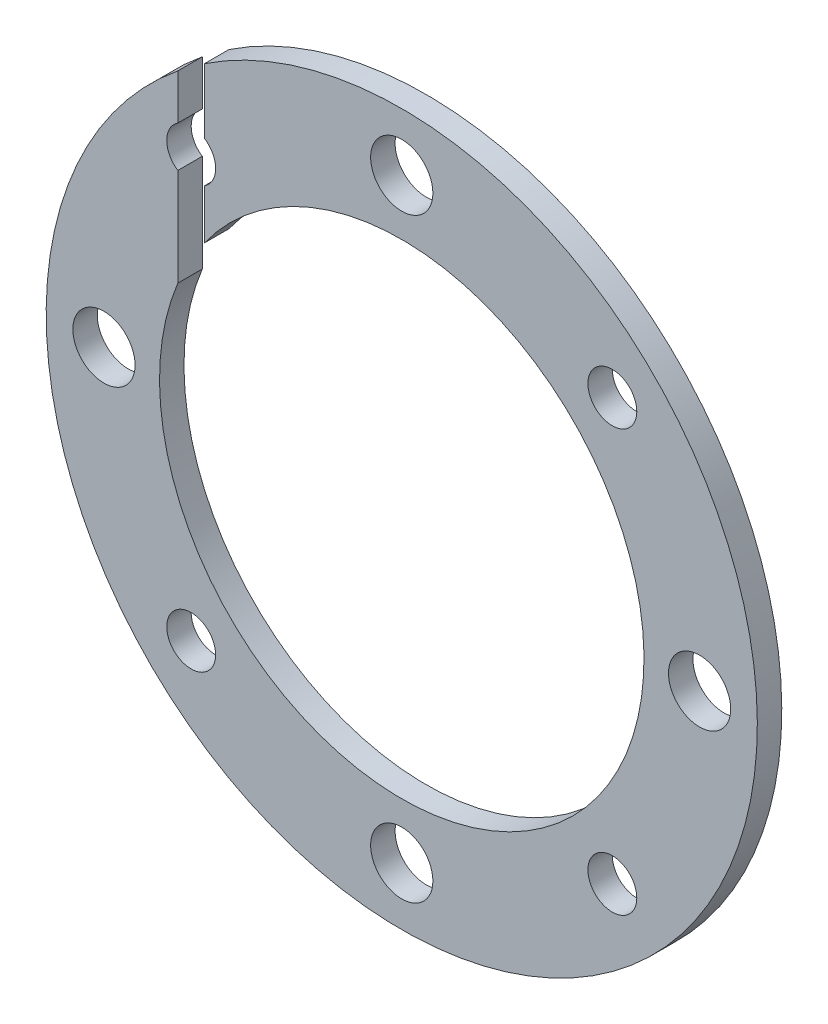
ISO-10303-21;
HEADER;
FILE_DESCRIPTION(('STEP AP214'),'2;1');
FILE_NAME('part.step','',(''),(''),'','','');
FILE_SCHEMA(('AUTOMOTIVE_DESIGN { 1 0 10303 214 1 1 1 1 }'));
ENDSEC;
DATA;
#1=APPLICATION_CONTEXT('core data for automotive mechanical design processes');
#2=APPLICATION_PROTOCOL_DEFINITION('international standard','automotive_design',2000,#1);
#3=PRODUCT_CONTEXT('',#1,'mechanical');
#4=PRODUCT('Part','Part','',(#3));
#5=PRODUCT_RELATED_PRODUCT_CATEGORY('part','',(#4));
#6=PRODUCT_DEFINITION_FORMATION('','',#4);
#7=PRODUCT_DEFINITION_CONTEXT('part definition',#1,'design');
#8=PRODUCT_DEFINITION('design','',#6,#7);
#9=PRODUCT_DEFINITION_SHAPE('','',#8);
#10=(LENGTH_UNIT() NAMED_UNIT(*) SI_UNIT(.MILLI.,.METRE.));
#11=(NAMED_UNIT(*) PLANE_ANGLE_UNIT() SI_UNIT($,.RADIAN.));
#12=(NAMED_UNIT(*) SI_UNIT($,.STERADIAN.) SOLID_ANGLE_UNIT());
#13=UNCERTAINTY_MEASURE_WITH_UNIT(LENGTH_MEASURE(1.E-05),#10,'distance_accuracy_value','');
#14=(GEOMETRIC_REPRESENTATION_CONTEXT(3) GLOBAL_UNCERTAINTY_ASSIGNED_CONTEXT((#13)) GLOBAL_UNIT_ASSIGNED_CONTEXT((#10,
#11,#12)) REPRESENTATION_CONTEXT('',''));
#15=CARTESIAN_POINT('',(0.,0.,0.));
#16=DIRECTION('',(0.,0.,1.));
#17=DIRECTION('',(1.,0.,0.));
#18=AXIS2_PLACEMENT_3D('',#15,#16,#17);
#19=CARTESIAN_POINT('',(-24.0670864044651,24.0670864044656,2.794));
#20=DIRECTION('',(0.,0.,-1.));
#21=DIRECTION('',(-1.,0.,0.));
#22=AXIS2_PLACEMENT_3D('',#19,#20,#21);
#23=CYLINDRICAL_SURFACE('',#22,2.794);
#24=DIRECTION('',(0.,0.,-1.));
#25=VECTOR('',#24,1.);
#26=CARTESIAN_POINT('',(-25.5910864044651,26.408850696618,2.794));
#27=LINE('',#26,#25);
#28=CARTESIAN_POINT('',(-25.5910864044651,26.408850696618,2.794));
#29=VERTEX_POINT('',#28);
#30=CARTESIAN_POINT('',(-25.5910864044651,26.408850696618,0.));
#31=VERTEX_POINT('',#30);
#32=EDGE_CURVE('E232',#29,#31,#27,.T.);
#33=ORIENTED_EDGE('',*,*,#32,.F.);
#34=CARTESIAN_POINT('',(-24.0670864044651,24.0670864044656,2.794));
#35=DIRECTION('',(0.,0.,1.));
#36=DIRECTION('',(1.,0.,0.));
#37=AXIS2_PLACEMENT_3D('',#34,#35,#36);
#38=CIRCLE('',#37,2.794);
#39=CARTESIAN_POINT('',(-25.5910864044651,21.7253221123132,2.794));
#40=VERTEX_POINT('',#39);
#41=EDGE_CURVE('E167',#29,#40,#38,.T.);
#42=ORIENTED_EDGE('',*,*,#41,.T.);
#43=DIRECTION('',(0.,0.,-1.));
#44=VECTOR('',#43,1.);
#45=CARTESIAN_POINT('',(-25.5910864044651,21.7253221123132,2.794));
#46=LINE('',#45,#44);
#47=CARTESIAN_POINT('',(-25.5910864044651,21.7253221123132,0.));
#48=VERTEX_POINT('',#47);
#49=EDGE_CURVE('E228',#48,#40,#46,.F.);
#50=ORIENTED_EDGE('',*,*,#49,.F.);
#51=CARTESIAN_POINT('',(-24.0670864044651,24.0670864044656,0.));
#52=DIRECTION('',(0.,0.,1.));
#53=DIRECTION('',(1.,0.,0.));
#54=AXIS2_PLACEMENT_3D('',#51,#52,#53);
#55=CIRCLE('',#54,2.794);
#56=EDGE_CURVE('E139',#31,#48,#55,.T.);
#57=ORIENTED_EDGE('',*,*,#56,.F.);
#58=EDGE_LOOP('',(#33,#42,#50,#57));
#59=FACE_BOUND('',#58,.T.);
#60=ADVANCED_FACE('F36',(#59),#23,.F.);
#61=CARTESIAN_POINT('',(0.,0.,2.794));
#62=DIRECTION('',(0.,0.,-1.));
#63=DIRECTION('',(-1.,0.,0.));
#64=AXIS2_PLACEMENT_3D('',#61,#62,#63);
#65=CYLINDRICAL_SURFACE('',#64,40.64);
#66=CARTESIAN_POINT('',(0.,0.,2.794));
#67=DIRECTION('',(0.,0.,1.));
#68=DIRECTION('',(1.,0.,0.));
#69=AXIS2_PLACEMENT_3D('',#66,#67,#68);
#70=CIRCLE('',#69,40.64);
#71=CARTESIAN_POINT('',(-25.5910864044651,31.5706492907448,2.794));
#72=VERTEX_POINT('',#71);
#73=CARTESIAN_POINT('',(-22.5430864044651,33.8144770085362,2.794));
#74=VERTEX_POINT('',#73);
#75=EDGE_CURVE('E129',#72,#74,#70,.T.);
#76=ORIENTED_EDGE('',*,*,#75,.F.);
#77=DIRECTION('',(0.,0.,-1.));
#78=VECTOR('',#77,1.);
#79=CARTESIAN_POINT('',(-25.5910864044651,31.5706492907448,2.794));
#80=LINE('',#79,#78);
#81=CARTESIAN_POINT('',(-25.5910864044651,31.5706492907448,0.));
#82=VERTEX_POINT('',#81);
#83=EDGE_CURVE('E140',#72,#82,#80,.T.);
#84=ORIENTED_EDGE('',*,*,#83,.T.);
#85=CARTESIAN_POINT('',(0.,0.,0.));
#86=DIRECTION('',(0.,0.,1.));
#87=DIRECTION('',(1.,0.,0.));
#88=AXIS2_PLACEMENT_3D('',#85,#86,#87);
#89=CIRCLE('',#88,40.64);
#90=CARTESIAN_POINT('',(-22.5430864044651,33.8144770085362,0.));
#91=VERTEX_POINT('',#90);
#92=EDGE_CURVE('E162',#82,#91,#89,.T.);
#93=ORIENTED_EDGE('',*,*,#92,.T.);
#94=DIRECTION('',(0.,0.,-1.));
#95=VECTOR('',#94,1.);
#96=CARTESIAN_POINT('',(-22.5430864044651,33.8144770085362,2.794));
#97=LINE('',#96,#95);
#98=EDGE_CURVE('E59',#91,#74,#97,.F.);
#99=ORIENTED_EDGE('',*,*,#98,.T.);
#100=EDGE_LOOP('',(#76,#84,#93,#99));
#101=FACE_BOUND('',#100,.T.);
#102=ADVANCED_FACE('F211',(#101),#65,.T.);
#103=CARTESIAN_POINT('',(-34.036,3.56508176546595E-13,2.794));
#104=DIRECTION('',(0.,0.,-1.));
#105=DIRECTION('',(-1.,0.,0.));
#106=AXIS2_PLACEMENT_3D('',#103,#104,#105);
#107=CYLINDRICAL_SURFACE('',#106,3.556);
#108=CARTESIAN_POINT('',(-34.036,3.56508176546595E-13,2.794));
#109=DIRECTION('',(0.,0.,1.));
#110=DIRECTION('',(1.,0.,0.));
#111=AXIS2_PLACEMENT_3D('',#108,#109,#110);
#112=CIRCLE('',#111,3.556);
#113=CARTESIAN_POINT('',(-30.48,3.56508176546595E-13,2.794));
#114=VERTEX_POINT('',#113);
#115=EDGE_CURVE('E132',#114,#114,#112,.T.);
#116=ORIENTED_EDGE('',*,*,#115,.T.);
#117=EDGE_LOOP('',(#116));
#118=FACE_BOUND('',#117,.T.);
#119=CARTESIAN_POINT('',(-34.036,3.56508176546595E-13,0.));
#120=DIRECTION('',(0.,0.,1.));
#121=DIRECTION('',(1.,0.,0.));
#122=AXIS2_PLACEMENT_3D('',#119,#120,#121);
#123=CIRCLE('',#122,3.556);
#124=CARTESIAN_POINT('',(-30.48,3.56508176546595E-13,0.));
#125=VERTEX_POINT('',#124);
#126=EDGE_CURVE('E159',#125,#125,#123,.T.);
#127=ORIENTED_EDGE('',*,*,#126,.F.);
#128=EDGE_LOOP('',(#127));
#129=FACE_BOUND('',#128,.T.);
#130=ADVANCED_FACE('F195',(#118,#129),#107,.F.);
#131=CARTESIAN_POINT('',(-24.0670864044655,-24.0670864044652,2.794));
#132=DIRECTION('',(0.,0.,-1.));
#133=DIRECTION('',(-1.,0.,0.));
#134=AXIS2_PLACEMENT_3D('',#131,#132,#133);
#135=CYLINDRICAL_SURFACE('',#134,2.794);
#136=CARTESIAN_POINT('',(-24.0670864044655,-24.0670864044652,2.794));
#137=DIRECTION('',(0.,0.,1.));
#138=DIRECTION('',(1.,0.,0.));
#139=AXIS2_PLACEMENT_3D('',#136,#137,#138);
#140=CIRCLE('',#139,2.794);
#141=CARTESIAN_POINT('',(-21.2730864044655,-24.0670864044652,2.794));
#142=VERTEX_POINT('',#141);
#143=EDGE_CURVE('E190',#142,#142,#140,.T.);
#144=ORIENTED_EDGE('',*,*,#143,.T.);
#145=EDGE_LOOP('',(#144));
#146=FACE_BOUND('',#145,.T.);
#147=CARTESIAN_POINT('',(-24.0670864044655,-24.0670864044652,0.));
#148=DIRECTION('',(0.,0.,1.));
#149=DIRECTION('',(1.,0.,0.));
#150=AXIS2_PLACEMENT_3D('',#147,#148,#149);
#151=CIRCLE('',#150,2.794);
#152=CARTESIAN_POINT('',(-21.2730864044655,-24.0670864044652,0.));
#153=VERTEX_POINT('',#152);
#154=EDGE_CURVE('E156',#153,#153,#151,.T.);
#155=ORIENTED_EDGE('',*,*,#154,.F.);
#156=EDGE_LOOP('',(#155));
#157=FACE_BOUND('',#156,.T.);
#158=ADVANCED_FACE('F335',(#146,#157),#135,.F.);
#159=CARTESIAN_POINT('',(-2.3767211769773E-13,-34.036,2.794));
#160=DIRECTION('',(0.,0.,-1.));
#161=DIRECTION('',(-1.,0.,0.));
#162=AXIS2_PLACEMENT_3D('',#159,#160,#161);
#163=CYLINDRICAL_SURFACE('',#162,3.556);
#164=CARTESIAN_POINT('',(-2.3767211769773E-13,-34.036,2.794));
#165=DIRECTION('',(0.,0.,1.));
#166=DIRECTION('',(1.,0.,0.));
#167=AXIS2_PLACEMENT_3D('',#164,#165,#166);
#168=CIRCLE('',#167,3.556);
#169=CARTESIAN_POINT('',(3.55599999999976,-34.036,2.794));
#170=VERTEX_POINT('',#169);
#171=EDGE_CURVE('E187',#170,#170,#168,.T.);
#172=ORIENTED_EDGE('',*,*,#171,.T.);
#173=EDGE_LOOP('',(#172));
#174=FACE_BOUND('',#173,.T.);
#175=CARTESIAN_POINT('',(-2.3767211769773E-13,-34.036,0.));
#176=DIRECTION('',(0.,0.,1.));
#177=DIRECTION('',(1.,0.,0.));
#178=AXIS2_PLACEMENT_3D('',#175,#176,#177);
#179=CIRCLE('',#178,3.556);
#180=CARTESIAN_POINT('',(3.55599999999976,-34.036,0.));
#181=VERTEX_POINT('',#180);
#182=EDGE_CURVE('E153',#181,#181,#179,.T.);
#183=ORIENTED_EDGE('',*,*,#182,.F.);
#184=EDGE_LOOP('',(#183));
#185=FACE_BOUND('',#184,.T.);
#186=ADVANCED_FACE('F325',(#174,#185),#163,.F.);
#187=CARTESIAN_POINT('',(24.0670864044652,-24.0670864044654,2.794));
#188=DIRECTION('',(0.,0.,-1.));
#189=DIRECTION('',(-1.,0.,0.));
#190=AXIS2_PLACEMENT_3D('',#187,#188,#189);
#191=CYLINDRICAL_SURFACE('',#190,2.794);
#192=CARTESIAN_POINT('',(24.0670864044652,-24.0670864044654,2.794));
#193=DIRECTION('',(0.,0.,1.));
#194=DIRECTION('',(1.,0.,0.));
#195=AXIS2_PLACEMENT_3D('',#192,#193,#194);
#196=CIRCLE('',#195,2.794);
#197=CARTESIAN_POINT('',(26.8610864044652,-24.0670864044654,2.794));
#198=VERTEX_POINT('',#197);
#199=EDGE_CURVE('E184',#198,#198,#196,.T.);
#200=ORIENTED_EDGE('',*,*,#199,.T.);
#201=EDGE_LOOP('',(#200));
#202=FACE_BOUND('',#201,.T.);
#203=CARTESIAN_POINT('',(24.0670864044652,-24.0670864044654,0.));
#204=DIRECTION('',(0.,0.,1.));
#205=DIRECTION('',(1.,0.,0.));
#206=AXIS2_PLACEMENT_3D('',#203,#204,#205);
#207=CIRCLE('',#206,2.794);
#208=CARTESIAN_POINT('',(26.8610864044652,-24.0670864044654,0.));
#209=VERTEX_POINT('',#208);
#210=EDGE_CURVE('E150',#209,#209,#207,.T.);
#211=ORIENTED_EDGE('',*,*,#210,.F.);
#212=EDGE_LOOP('',(#211));
#213=FACE_BOUND('',#212,.T.);
#214=ADVANCED_FACE('F315',(#202,#213),#191,.F.);
#215=CARTESIAN_POINT('',(34.036,-1.18836058848865E-13,2.794));
#216=DIRECTION('',(0.,0.,-1.));
#217=DIRECTION('',(-1.,0.,0.));
#218=AXIS2_PLACEMENT_3D('',#215,#216,#217);
#219=CYLINDRICAL_SURFACE('',#218,3.556);
#220=CARTESIAN_POINT('',(34.036,-1.18836058848865E-13,2.794));
#221=DIRECTION('',(0.,0.,1.));
#222=DIRECTION('',(1.,0.,0.));
#223=AXIS2_PLACEMENT_3D('',#220,#221,#222);
#224=CIRCLE('',#223,3.556);
#225=CARTESIAN_POINT('',(37.592,-1.18836058848865E-13,2.794));
#226=VERTEX_POINT('',#225);
#227=EDGE_CURVE('E181',#226,#226,#224,.T.);
#228=ORIENTED_EDGE('',*,*,#227,.T.);
#229=EDGE_LOOP('',(#228));
#230=FACE_BOUND('',#229,.T.);
#231=CARTESIAN_POINT('',(34.036,-1.18836058848865E-13,0.));
#232=DIRECTION('',(0.,0.,1.));
#233=DIRECTION('',(1.,0.,0.));
#234=AXIS2_PLACEMENT_3D('',#231,#232,#233);
#235=CIRCLE('',#234,3.556);
#236=CARTESIAN_POINT('',(37.592,-1.18836058848865E-13,0.));
#237=VERTEX_POINT('',#236);
#238=EDGE_CURVE('E147',#237,#237,#235,.T.);
#239=ORIENTED_EDGE('',*,*,#238,.F.);
#240=EDGE_LOOP('',(#239));
#241=FACE_BOUND('',#240,.T.);
#242=ADVANCED_FACE('F305',(#230,#241),#219,.F.);
#243=CARTESIAN_POINT('',(24.0670864044653,24.0670864044653,2.794));
#244=DIRECTION('',(0.,0.,-1.));
#245=DIRECTION('',(-1.,0.,0.));
#246=AXIS2_PLACEMENT_3D('',#243,#244,#245);
#247=CYLINDRICAL_SURFACE('',#246,2.794);
#248=CARTESIAN_POINT('',(24.0670864044653,24.0670864044653,2.794));
#249=DIRECTION('',(0.,0.,1.));
#250=DIRECTION('',(1.,0.,0.));
#251=AXIS2_PLACEMENT_3D('',#248,#249,#250);
#252=CIRCLE('',#251,2.794);
#253=CARTESIAN_POINT('',(26.8610864044653,24.0670864044653,2.794));
#254=VERTEX_POINT('',#253);
#255=EDGE_CURVE('E178',#254,#254,#252,.T.);
#256=ORIENTED_EDGE('',*,*,#255,.T.);
#257=EDGE_LOOP('',(#256));
#258=FACE_BOUND('',#257,.T.);
#259=CARTESIAN_POINT('',(24.0670864044653,24.0670864044653,0.));
#260=DIRECTION('',(0.,0.,1.));
#261=DIRECTION('',(1.,0.,0.));
#262=AXIS2_PLACEMENT_3D('',#259,#260,#261);
#263=CIRCLE('',#262,2.794);
#264=CARTESIAN_POINT('',(26.8610864044653,24.0670864044653,0.));
#265=VERTEX_POINT('',#264);
#266=EDGE_CURVE('E144',#265,#265,#263,.T.);
#267=ORIENTED_EDGE('',*,*,#266,.F.);
#268=EDGE_LOOP('',(#267));
#269=FACE_BOUND('',#268,.T.);
#270=ADVANCED_FACE('F224',(#258,#269),#247,.F.);
#271=CARTESIAN_POINT('',(0.,34.036,2.794));
#272=DIRECTION('',(0.,0.,-1.));
#273=DIRECTION('',(-1.,0.,0.));
#274=AXIS2_PLACEMENT_3D('',#271,#272,#273);
#275=CYLINDRICAL_SURFACE('',#274,3.556);
#276=CARTESIAN_POINT('',(0.,34.036,2.794));
#277=DIRECTION('',(0.,0.,1.));
#278=DIRECTION('',(1.,0.,0.));
#279=AXIS2_PLACEMENT_3D('',#276,#277,#278);
#280=CIRCLE('',#279,3.556);
#281=CARTESIAN_POINT('',(3.556,34.036,2.794));
#282=VERTEX_POINT('',#281);
#283=EDGE_CURVE('E172',#282,#282,#280,.T.);
#284=ORIENTED_EDGE('',*,*,#283,.T.);
#285=EDGE_LOOP('',(#284));
#286=FACE_BOUND('',#285,.T.);
#287=CARTESIAN_POINT('',(0.,34.036,0.));
#288=DIRECTION('',(0.,0.,1.));
#289=DIRECTION('',(1.,0.,0.));
#290=AXIS2_PLACEMENT_3D('',#287,#288,#289);
#291=CIRCLE('',#290,3.556);
#292=CARTESIAN_POINT('',(3.556,34.036,0.));
#293=VERTEX_POINT('',#292);
#294=EDGE_CURVE('E141',#293,#293,#291,.T.);
#295=ORIENTED_EDGE('',*,*,#294,.F.);
#296=EDGE_LOOP('',(#295));
#297=FACE_BOUND('',#296,.T.);
#298=ADVANCED_FACE('F220',(#286,#297),#275,.F.);
#299=DIRECTION('',(0.,0.,-1.));
#300=VECTOR('',#299,1.);
#301=CARTESIAN_POINT('',(-22.5430864044651,21.7253221123132,2.794));
#302=LINE('',#301,#300);
#303=CARTESIAN_POINT('',(-22.5430864044651,21.7253221123132,2.794));
#304=VERTEX_POINT('',#303);
#305=CARTESIAN_POINT('',(-22.5430864044651,21.7253221123132,0.));
#306=VERTEX_POINT('',#305);
#307=EDGE_CURVE('E111',#304,#306,#302,.T.);
#308=ORIENTED_EDGE('',*,*,#307,.F.);
#309=CARTESIAN_POINT('',(-22.5430864044651,26.408850696618,2.794));
#310=VERTEX_POINT('',#309);
#311=EDGE_CURVE('E123',#304,#310,#38,.T.);
#312=ORIENTED_EDGE('',*,*,#311,.T.);
#313=DIRECTION('',(0.,0.,-1.));
#314=VECTOR('',#313,1.);
#315=CARTESIAN_POINT('',(-22.5430864044651,26.408850696618,2.794));
#316=LINE('',#315,#314);
#317=CARTESIAN_POINT('',(-22.5430864044651,26.408850696618,0.));
#318=VERTEX_POINT('',#317);
#319=EDGE_CURVE('E124',#318,#310,#316,.F.);
#320=ORIENTED_EDGE('',*,*,#319,.F.);
#321=EDGE_CURVE('E136',#306,#318,#55,.T.);
#322=ORIENTED_EDGE('',*,*,#321,.F.);
#323=EDGE_LOOP('',(#308,#312,#320,#322));
#324=FACE_BOUND('',#323,.T.);
#325=ADVANCED_FACE('F38',(#324),#23,.F.);
#326=CARTESIAN_POINT('',(0.,0.,2.794));
#327=DIRECTION('',(0.,0.,-1.));
#328=DIRECTION('',(-1.,0.,0.));
#329=AXIS2_PLACEMENT_3D('',#326,#327,#328);
#330=CYLINDRICAL_SURFACE('',#329,27.686);
#331=DIRECTION('',(0.,0.,-1.));
#332=VECTOR('',#331,1.);
#333=CARTESIAN_POINT('',(-25.5910864044651,10.5646056546945,2.794));
#334=LINE('',#333,#332);
#335=CARTESIAN_POINT('',(-25.5910864044651,10.5646056546945,2.794));
#336=VERTEX_POINT('',#335);
#337=CARTESIAN_POINT('',(-25.5910864044651,10.5646056546945,0.));
#338=VERTEX_POINT('',#337);
#339=EDGE_CURVE('E51',#336,#338,#334,.T.);
#340=ORIENTED_EDGE('',*,*,#339,.F.);
#341=CARTESIAN_POINT('',(0.,0.,2.794));
#342=DIRECTION('',(0.,0.,1.));
#343=DIRECTION('',(1.,0.,0.));
#344=AXIS2_PLACEMENT_3D('',#341,#342,#343);
#345=CIRCLE('',#344,27.686);
#346=CARTESIAN_POINT('',(-22.5430864044651,16.0724562951909,2.794));
#347=VERTEX_POINT('',#346);
#348=EDGE_CURVE('E120',#336,#347,#345,.T.);
#349=ORIENTED_EDGE('',*,*,#348,.T.);
#350=DIRECTION('',(0.,0.,-1.));
#351=VECTOR('',#350,1.);
#352=CARTESIAN_POINT('',(-22.5430864044651,16.0724562951909,2.794));
#353=LINE('',#352,#351);
#354=CARTESIAN_POINT('',(-22.5430864044651,16.0724562951909,0.));
#355=VERTEX_POINT('',#354);
#356=EDGE_CURVE('E100',#355,#347,#353,.F.);
#357=ORIENTED_EDGE('',*,*,#356,.F.);
#358=CARTESIAN_POINT('',(0.,0.,0.));
#359=DIRECTION('',(0.,0.,1.));
#360=DIRECTION('',(1.,0.,0.));
#361=AXIS2_PLACEMENT_3D('',#358,#359,#360);
#362=CIRCLE('',#361,27.686);
#363=EDGE_CURVE('E165',#338,#355,#362,.T.);
#364=ORIENTED_EDGE('',*,*,#363,.F.);
#365=EDGE_LOOP('',(#340,#349,#357,#364));
#366=FACE_BOUND('',#365,.T.);
#367=ADVANCED_FACE('F127',(#366),#330,.F.);
#368=CARTESIAN_POINT('',(0.,0.,2.794));
#369=DIRECTION('',(0.,0.,1.));
#370=DIRECTION('',(1.,0.,0.));
#371=AXIS2_PLACEMENT_3D('',#368,#369,#370);
#372=PLANE('',#371);
#373=DIRECTION('',(0.,-1.,0.));
#374=VECTOR('',#373,1.);
#375=CARTESIAN_POINT('',(-25.5910864044651,48.1341728089311,2.794));
#376=LINE('',#375,#374);
#377=EDGE_CURVE('E241',#72,#29,#376,.T.);
#378=ORIENTED_EDGE('',*,*,#377,.F.);
#379=ORIENTED_EDGE('',*,*,#75,.T.);
#380=DIRECTION('',(0.,1.,0.));
#381=VECTOR('',#380,1.);
#382=CARTESIAN_POINT('',(-22.5430864044651,48.1341728089311,2.794));
#383=LINE('',#382,#381);
#384=EDGE_CURVE('E125',#310,#74,#383,.T.);
#385=ORIENTED_EDGE('',*,*,#384,.F.);
#386=ORIENTED_EDGE('',*,*,#311,.F.);
#387=EDGE_CURVE('E103',#347,#304,#383,.T.);
#388=ORIENTED_EDGE('',*,*,#387,.F.);
#389=ORIENTED_EDGE('',*,*,#348,.F.);
#390=EDGE_CURVE('E242',#40,#336,#376,.T.);
#391=ORIENTED_EDGE('',*,*,#390,.F.);
#392=ORIENTED_EDGE('',*,*,#41,.F.);
#393=EDGE_LOOP('',(#378,#379,#385,#386,#388,#389,#391,#392));
#394=FACE_BOUND('',#393,.T.);
#395=ORIENTED_EDGE('',*,*,#283,.F.);
#396=EDGE_LOOP('',(#395));
#397=FACE_BOUND('',#396,.T.);
#398=ORIENTED_EDGE('',*,*,#255,.F.);
#399=EDGE_LOOP('',(#398));
#400=FACE_BOUND('',#399,.T.);
#401=ORIENTED_EDGE('',*,*,#227,.F.);
#402=EDGE_LOOP('',(#401));
#403=FACE_BOUND('',#402,.T.);
#404=ORIENTED_EDGE('',*,*,#199,.F.);
#405=EDGE_LOOP('',(#404));
#406=FACE_BOUND('',#405,.T.);
#407=ORIENTED_EDGE('',*,*,#171,.F.);
#408=EDGE_LOOP('',(#407));
#409=FACE_BOUND('',#408,.T.);
#410=ORIENTED_EDGE('',*,*,#143,.F.);
#411=EDGE_LOOP('',(#410));
#412=FACE_BOUND('',#411,.T.);
#413=ORIENTED_EDGE('',*,*,#115,.F.);
#414=EDGE_LOOP('',(#413));
#415=FACE_BOUND('',#414,.T.);
#416=ADVANCED_FACE('F117',(#394,#397,#400,#403,#406,#409,#412,#415),#372,.T.);
#417=CARTESIAN_POINT('',(0.,0.,0.));
#418=DIRECTION('',(0.,0.,1.));
#419=DIRECTION('',(1.,0.,0.));
#420=AXIS2_PLACEMENT_3D('',#417,#418,#419);
#421=PLANE('',#420);
#422=ORIENTED_EDGE('',*,*,#294,.T.);
#423=EDGE_LOOP('',(#422));
#424=FACE_BOUND('',#423,.T.);
#425=ORIENTED_EDGE('',*,*,#266,.T.);
#426=EDGE_LOOP('',(#425));
#427=FACE_BOUND('',#426,.T.);
#428=ORIENTED_EDGE('',*,*,#238,.T.);
#429=EDGE_LOOP('',(#428));
#430=FACE_BOUND('',#429,.T.);
#431=ORIENTED_EDGE('',*,*,#210,.T.);
#432=EDGE_LOOP('',(#431));
#433=FACE_BOUND('',#432,.T.);
#434=ORIENTED_EDGE('',*,*,#182,.T.);
#435=EDGE_LOOP('',(#434));
#436=FACE_BOUND('',#435,.T.);
#437=ORIENTED_EDGE('',*,*,#154,.T.);
#438=EDGE_LOOP('',(#437));
#439=FACE_BOUND('',#438,.T.);
#440=ORIENTED_EDGE('',*,*,#126,.T.);
#441=EDGE_LOOP('',(#440));
#442=FACE_BOUND('',#441,.T.);
#443=ORIENTED_EDGE('',*,*,#92,.F.);
#444=DIRECTION('',(0.,-1.,0.));
#445=VECTOR('',#444,1.);
#446=CARTESIAN_POINT('',(-25.5910864044651,0.,0.));
#447=LINE('',#446,#445);
#448=EDGE_CURVE('E11',#82,#31,#447,.T.);
#449=ORIENTED_EDGE('',*,*,#448,.T.);
#450=ORIENTED_EDGE('',*,*,#56,.T.);
#451=EDGE_CURVE('E40',#48,#338,#447,.T.);
#452=ORIENTED_EDGE('',*,*,#451,.T.);
#453=ORIENTED_EDGE('',*,*,#363,.T.);
#454=DIRECTION('',(0.,1.,0.));
#455=VECTOR('',#454,1.);
#456=CARTESIAN_POINT('',(-22.5430864044651,0.,0.));
#457=LINE('',#456,#455);
#458=EDGE_CURVE('E106',#355,#306,#457,.T.);
#459=ORIENTED_EDGE('',*,*,#458,.T.);
#460=ORIENTED_EDGE('',*,*,#321,.T.);
#461=EDGE_CURVE('E128',#318,#91,#457,.T.);
#462=ORIENTED_EDGE('',*,*,#461,.T.);
#463=EDGE_LOOP('',(#443,#449,#450,#452,#453,#459,#460,#462));
#464=FACE_BOUND('',#463,.T.);
#465=ADVANCED_FACE('F199',(#424,#427,#430,#433,#436,#439,#442,#464),#421,.F.);
#466=CARTESIAN_POINT('',(-22.5430864044651,48.1341728089311,-11.303));
#467=DIRECTION('',(1.,0.,0.));
#468=DIRECTION('',(0.,1.,0.));
#469=AXIS2_PLACEMENT_3D('',#466,#467,#468);
#470=PLANE('',#469);
#471=ORIENTED_EDGE('',*,*,#461,.F.);
#472=ORIENTED_EDGE('',*,*,#319,.T.);
#473=ORIENTED_EDGE('',*,*,#384,.T.);
#474=ORIENTED_EDGE('',*,*,#98,.F.);
#475=EDGE_LOOP('',(#471,#472,#473,#474));
#476=FACE_BOUND('',#475,.T.);
#477=ADVANCED_FACE('F205',(#476),#470,.F.);
#478=ORIENTED_EDGE('',*,*,#307,.T.);
#479=ORIENTED_EDGE('',*,*,#458,.F.);
#480=ORIENTED_EDGE('',*,*,#356,.T.);
#481=ORIENTED_EDGE('',*,*,#387,.T.);
#482=EDGE_LOOP('',(#478,#479,#480,#481));
#483=FACE_BOUND('',#482,.T.);
#484=ADVANCED_FACE('F102',(#483),#470,.F.);
#485=CARTESIAN_POINT('',(-25.5910864044651,48.1341728089311,-11.303));
#486=DIRECTION('',(-1.,0.,0.));
#487=DIRECTION('',(0.,-1.,0.));
#488=AXIS2_PLACEMENT_3D('',#485,#486,#487);
#489=PLANE('',#488);
#490=ORIENTED_EDGE('',*,*,#49,.T.);
#491=ORIENTED_EDGE('',*,*,#390,.T.);
#492=ORIENTED_EDGE('',*,*,#339,.T.);
#493=ORIENTED_EDGE('',*,*,#451,.F.);
#494=EDGE_LOOP('',(#490,#491,#492,#493));
#495=FACE_BOUND('',#494,.T.);
#496=ADVANCED_FACE('F246',(#495),#489,.F.);
#497=ORIENTED_EDGE('',*,*,#377,.T.);
#498=ORIENTED_EDGE('',*,*,#32,.T.);
#499=ORIENTED_EDGE('',*,*,#448,.F.);
#500=ORIENTED_EDGE('',*,*,#83,.F.);
#501=EDGE_LOOP('',(#497,#498,#499,#500));
#502=FACE_BOUND('',#501,.T.);
#503=ADVANCED_FACE('F243',(#502),#489,.F.);
#504=CLOSED_SHELL('',(#60,#102,#130,#158,#186,#214,#242,#270,#298,#325,#367,#416,#465,#477,#484,
#496,#503));
#505=MANIFOLD_SOLID_BREP('B2',#504);
#506=ADVANCED_BREP_SHAPE_REPRESENTATION('',(#18,#505),#14);
#507=SHAPE_DEFINITION_REPRESENTATION(#9,#506);
ENDSEC;
END-ISO-10303-21;
